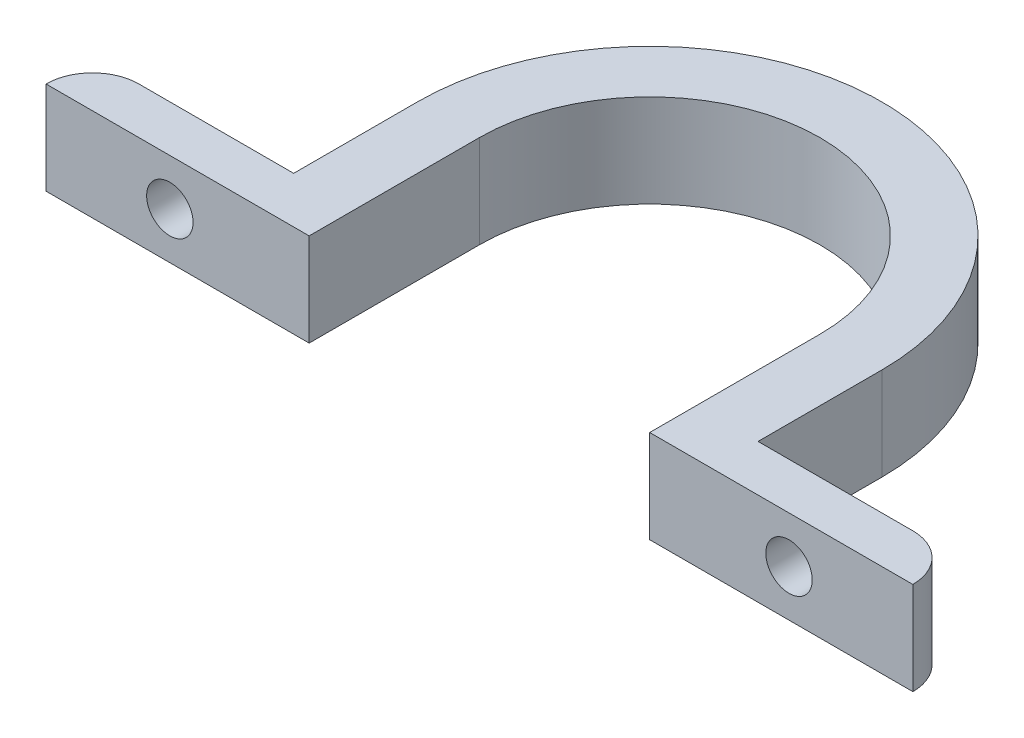
ISO-10303-21;
HEADER;
FILE_DESCRIPTION(('STEP AP214'),'2;1');
FILE_NAME('part.step','',(''),(''),'','','');
FILE_SCHEMA(('AUTOMOTIVE_DESIGN { 1 0 10303 214 1 1 1 1 }'));
ENDSEC;
DATA;
#1=APPLICATION_CONTEXT('core data for automotive mechanical design processes');
#2=APPLICATION_PROTOCOL_DEFINITION('international standard','automotive_design',2000,#1);
#3=PRODUCT_CONTEXT('',#1,'mechanical');
#4=PRODUCT('Part','Part','',(#3));
#5=PRODUCT_RELATED_PRODUCT_CATEGORY('part','',(#4));
#6=PRODUCT_DEFINITION_FORMATION('','',#4);
#7=PRODUCT_DEFINITION_CONTEXT('part definition',#1,'design');
#8=PRODUCT_DEFINITION('design','',#6,#7);
#9=PRODUCT_DEFINITION_SHAPE('','',#8);
#10=(LENGTH_UNIT() NAMED_UNIT(*) SI_UNIT(.MILLI.,.METRE.));
#11=(NAMED_UNIT(*) PLANE_ANGLE_UNIT() SI_UNIT($,.RADIAN.));
#12=(NAMED_UNIT(*) SI_UNIT($,.STERADIAN.) SOLID_ANGLE_UNIT());
#13=UNCERTAINTY_MEASURE_WITH_UNIT(LENGTH_MEASURE(1.E-05),#10,'distance_accuracy_value','');
#14=(GEOMETRIC_REPRESENTATION_CONTEXT(3) GLOBAL_UNCERTAINTY_ASSIGNED_CONTEXT((#13)) GLOBAL_UNIT_ASSIGNED_CONTEXT((#10,
#11,#12)) REPRESENTATION_CONTEXT('',''));
#15=CARTESIAN_POINT('',(0.,0.,0.));
#16=DIRECTION('',(0.,0.,1.));
#17=DIRECTION('',(1.,0.,0.));
#18=AXIS2_PLACEMENT_3D('',#15,#16,#17);
#19=CARTESIAN_POINT('',(13.,6.,-0.5));
#20=DIRECTION('',(0.,-1.,0.));
#21=DIRECTION('',(0.,0.,-1.));
#22=AXIS2_PLACEMENT_3D('',#19,#20,#21);
#23=CYLINDRICAL_SURFACE('',#22,15.);
#24=CARTESIAN_POINT('',(13.,0.,-0.5));
#25=DIRECTION('',(0.,1.,0.));
#26=DIRECTION('',(0.,0.,-1.));
#27=AXIS2_PLACEMENT_3D('',#24,#25,#26);
#28=CIRCLE('',#27,15.);
#29=CARTESIAN_POINT('',(28.,0.,-0.500000000000002));
#30=VERTEX_POINT('',#29);
#31=CARTESIAN_POINT('',(-2.,0.,-0.5));
#32=VERTEX_POINT('',#31);
#33=EDGE_CURVE('E163',#30,#32,#28,.T.);
#34=ORIENTED_EDGE('',*,*,#33,.T.);
#35=DIRECTION('',(0.,-1.,0.));
#36=VECTOR('',#35,1.);
#37=CARTESIAN_POINT('',(-2.,6.,-0.5));
#38=LINE('',#37,#36);
#39=CARTESIAN_POINT('',(-2.,6.,-0.5));
#40=VERTEX_POINT('',#39);
#41=EDGE_CURVE('E11',#40,#32,#38,.T.);
#42=ORIENTED_EDGE('',*,*,#41,.F.);
#43=CARTESIAN_POINT('',(13.,6.,-0.5));
#44=DIRECTION('',(0.,1.,0.));
#45=DIRECTION('',(0.,0.,-1.));
#46=AXIS2_PLACEMENT_3D('',#43,#44,#45);
#47=CIRCLE('',#46,15.);
#48=CARTESIAN_POINT('',(28.,6.,-0.500000000000002));
#49=VERTEX_POINT('',#48);
#50=EDGE_CURVE('E186',#49,#40,#47,.T.);
#51=ORIENTED_EDGE('',*,*,#50,.F.);
#52=DIRECTION('',(0.,-1.,0.));
#53=VECTOR('',#52,1.);
#54=CARTESIAN_POINT('',(28.,6.,-0.500000000000002));
#55=LINE('',#54,#53);
#56=EDGE_CURVE('E159',#49,#30,#55,.T.);
#57=ORIENTED_EDGE('',*,*,#56,.T.);
#58=EDGE_LOOP('',(#34,#42,#51,#57));
#59=FACE_BOUND('',#58,.T.);
#60=ADVANCED_FACE('F43',(#59),#23,.T.);
#61=CARTESIAN_POINT('',(-2.,6.,7.5));
#62=DIRECTION('',(1.,0.,0.));
#63=DIRECTION('',(0.,0.,-1.));
#64=AXIS2_PLACEMENT_3D('',#61,#62,#63);
#65=PLANE('',#64);
#66=DIRECTION('',(0.,0.,1.));
#67=VECTOR('',#66,1.);
#68=CARTESIAN_POINT('',(-2.,0.,7.5));
#69=LINE('',#68,#67);
#70=CARTESIAN_POINT('',(-2.,0.,7.5));
#71=VERTEX_POINT('',#70);
#72=EDGE_CURVE('E166',#32,#71,#69,.T.);
#73=ORIENTED_EDGE('',*,*,#72,.T.);
#74=DIRECTION('',(0.,-1.,0.));
#75=VECTOR('',#74,1.);
#76=CARTESIAN_POINT('',(-2.,6.,7.5));
#77=LINE('',#76,#75);
#78=CARTESIAN_POINT('',(-2.,6.,7.5));
#79=VERTEX_POINT('',#78);
#80=EDGE_CURVE('E51',#79,#71,#77,.T.);
#81=ORIENTED_EDGE('',*,*,#80,.F.);
#82=DIRECTION('',(0.,0.,1.));
#83=VECTOR('',#82,1.);
#84=CARTESIAN_POINT('',(-2.,6.,7.5));
#85=LINE('',#84,#83);
#86=EDGE_CURVE('E114',#40,#79,#85,.T.);
#87=ORIENTED_EDGE('',*,*,#86,.F.);
#88=ORIENTED_EDGE('',*,*,#41,.T.);
#89=EDGE_LOOP('',(#73,#81,#87,#88));
#90=FACE_BOUND('',#89,.T.);
#91=ADVANCED_FACE('F266',(#90),#65,.F.);
#92=CARTESIAN_POINT('',(-12.,6.,7.5));
#93=DIRECTION('',(0.,0.,1.));
#94=DIRECTION('',(1.,0.,0.));
#95=AXIS2_PLACEMENT_3D('',#92,#93,#94);
#96=PLANE('',#95);
#97=CARTESIAN_POINT('',(-7.,3.,7.5));
#98=DIRECTION('',(0.,0.,-1.));
#99=DIRECTION('',(1.,0.,0.));
#100=AXIS2_PLACEMENT_3D('',#97,#98,#99);
#101=CIRCLE('',#100,1.5);
#102=CARTESIAN_POINT('',(-5.5,3.,7.5));
#103=VERTEX_POINT('',#102);
#104=EDGE_CURVE('E390',#103,#103,#101,.T.);
#105=ORIENTED_EDGE('',*,*,#104,.F.);
#106=EDGE_LOOP('',(#105));
#107=FACE_BOUND('',#106,.T.);
#108=DIRECTION('',(-1.,0.,0.));
#109=VECTOR('',#108,1.);
#110=CARTESIAN_POINT('',(-12.,0.,7.5));
#111=LINE('',#110,#109);
#112=CARTESIAN_POINT('',(-12.,0.,7.5));
#113=VERTEX_POINT('',#112);
#114=EDGE_CURVE('E169',#71,#113,#111,.T.);
#115=ORIENTED_EDGE('',*,*,#114,.T.);
#116=DIRECTION('',(0.,-1.,0.));
#117=VECTOR('',#116,1.);
#118=CARTESIAN_POINT('',(-12.,6.,7.5));
#119=LINE('',#118,#117);
#120=CARTESIAN_POINT('',(-12.,6.,7.5));
#121=VERTEX_POINT('',#120);
#122=EDGE_CURVE('E205',#121,#113,#119,.T.);
#123=ORIENTED_EDGE('',*,*,#122,.F.);
#124=DIRECTION('',(-1.,0.,0.));
#125=VECTOR('',#124,1.);
#126=CARTESIAN_POINT('',(-12.,6.,7.5));
#127=LINE('',#126,#125);
#128=EDGE_CURVE('E213',#79,#121,#127,.T.);
#129=ORIENTED_EDGE('',*,*,#128,.F.);
#130=ORIENTED_EDGE('',*,*,#80,.T.);
#131=EDGE_LOOP('',(#115,#123,#129,#130));
#132=FACE_BOUND('',#131,.T.);
#133=ADVANCED_FACE('F211',(#107,#132),#96,.F.);
#134=CARTESIAN_POINT('',(-12.,6.,10.5));
#135=DIRECTION('',(0.,-1.,0.));
#136=DIRECTION('',(0.,0.,-1.));
#137=AXIS2_PLACEMENT_3D('',#134,#135,#136);
#138=CYLINDRICAL_SURFACE('',#137,3.);
#139=CARTESIAN_POINT('',(-12.,0.,10.5));
#140=DIRECTION('',(0.,1.,0.));
#141=DIRECTION('',(0.,0.,-1.));
#142=AXIS2_PLACEMENT_3D('',#139,#140,#141);
#143=CIRCLE('',#142,3.);
#144=CARTESIAN_POINT('',(-15.,0.,10.5));
#145=VERTEX_POINT('',#144);
#146=EDGE_CURVE('E171',#113,#145,#143,.T.);
#147=ORIENTED_EDGE('',*,*,#146,.T.);
#148=DIRECTION('',(0.,-1.,0.));
#149=VECTOR('',#148,1.);
#150=CARTESIAN_POINT('',(-15.,6.,10.5));
#151=LINE('',#150,#149);
#152=CARTESIAN_POINT('',(-15.,6.,10.5));
#153=VERTEX_POINT('',#152);
#154=EDGE_CURVE('E202',#153,#145,#151,.T.);
#155=ORIENTED_EDGE('',*,*,#154,.F.);
#156=CARTESIAN_POINT('',(-12.,6.,10.5));
#157=DIRECTION('',(0.,1.,0.));
#158=DIRECTION('',(0.,0.,-1.));
#159=AXIS2_PLACEMENT_3D('',#156,#157,#158);
#160=CIRCLE('',#159,3.);
#161=EDGE_CURVE('E231',#121,#153,#160,.T.);
#162=ORIENTED_EDGE('',*,*,#161,.F.);
#163=ORIENTED_EDGE('',*,*,#122,.T.);
#164=EDGE_LOOP('',(#147,#155,#162,#163));
#165=FACE_BOUND('',#164,.T.);
#166=ADVANCED_FACE('F222',(#165),#138,.T.);
#167=CARTESIAN_POINT('',(2.,6.,10.5));
#168=DIRECTION('',(0.,0.,-1.));
#169=DIRECTION('',(-1.,0.,0.));
#170=AXIS2_PLACEMENT_3D('',#167,#168,#169);
#171=PLANE('',#170);
#172=CARTESIAN_POINT('',(-7.,3.,10.5));
#173=DIRECTION('',(0.,0.,-1.));
#174=DIRECTION('',(1.,0.,0.));
#175=AXIS2_PLACEMENT_3D('',#172,#173,#174);
#176=CIRCLE('',#175,1.5);
#177=CARTESIAN_POINT('',(-5.5,3.,10.5));
#178=VERTEX_POINT('',#177);
#179=EDGE_CURVE('E387',#178,#178,#176,.T.);
#180=ORIENTED_EDGE('',*,*,#179,.T.);
#181=EDGE_LOOP('',(#180));
#182=FACE_BOUND('',#181,.T.);
#183=DIRECTION('',(1.,0.,0.));
#184=VECTOR('',#183,1.);
#185=CARTESIAN_POINT('',(2.,0.,10.5));
#186=LINE('',#185,#184);
#187=CARTESIAN_POINT('',(2.,0.,10.5));
#188=VERTEX_POINT('',#187);
#189=EDGE_CURVE('E173',#145,#188,#186,.T.);
#190=ORIENTED_EDGE('',*,*,#189,.T.);
#191=DIRECTION('',(0.,-1.,0.));
#192=VECTOR('',#191,1.);
#193=CARTESIAN_POINT('',(2.,6.,10.5));
#194=LINE('',#193,#192);
#195=CARTESIAN_POINT('',(2.,6.,10.5));
#196=VERTEX_POINT('',#195);
#197=EDGE_CURVE('E199',#196,#188,#194,.T.);
#198=ORIENTED_EDGE('',*,*,#197,.F.);
#199=DIRECTION('',(1.,0.,0.));
#200=VECTOR('',#199,1.);
#201=CARTESIAN_POINT('',(2.,6.,10.5));
#202=LINE('',#201,#200);
#203=EDGE_CURVE('E228',#153,#196,#202,.T.);
#204=ORIENTED_EDGE('',*,*,#203,.F.);
#205=ORIENTED_EDGE('',*,*,#154,.T.);
#206=EDGE_LOOP('',(#190,#198,#204,#205));
#207=FACE_BOUND('',#206,.T.);
#208=ADVANCED_FACE('F226',(#182,#207),#171,.F.);
#209=CARTESIAN_POINT('',(2.,6.,-0.500000000000002));
#210=DIRECTION('',(-1.,0.,0.));
#211=DIRECTION('',(0.,0.,1.));
#212=AXIS2_PLACEMENT_3D('',#209,#210,#211);
#213=PLANE('',#212);
#214=DIRECTION('',(0.,0.,-1.));
#215=VECTOR('',#214,1.);
#216=CARTESIAN_POINT('',(2.,0.,-0.500000000000002));
#217=LINE('',#216,#215);
#218=CARTESIAN_POINT('',(2.,0.,-0.500000000000002));
#219=VERTEX_POINT('',#218);
#220=EDGE_CURVE('E175',#188,#219,#217,.T.);
#221=ORIENTED_EDGE('',*,*,#220,.T.);
#222=DIRECTION('',(0.,-1.,0.));
#223=VECTOR('',#222,1.);
#224=CARTESIAN_POINT('',(2.,6.,-0.500000000000002));
#225=LINE('',#224,#223);
#226=CARTESIAN_POINT('',(2.,6.,-0.500000000000002));
#227=VERTEX_POINT('',#226);
#228=EDGE_CURVE('E196',#227,#219,#225,.T.);
#229=ORIENTED_EDGE('',*,*,#228,.F.);
#230=DIRECTION('',(0.,0.,-1.));
#231=VECTOR('',#230,1.);
#232=CARTESIAN_POINT('',(2.,6.,-0.500000000000002));
#233=LINE('',#232,#231);
#234=EDGE_CURVE('E230',#196,#227,#233,.T.);
#235=ORIENTED_EDGE('',*,*,#234,.F.);
#236=ORIENTED_EDGE('',*,*,#197,.T.);
#237=EDGE_LOOP('',(#221,#229,#235,#236));
#238=FACE_BOUND('',#237,.T.);
#239=ADVANCED_FACE('F280',(#238),#213,.F.);
#240=CARTESIAN_POINT('',(13.,6.,-0.5));
#241=DIRECTION('',(0.,-1.,0.));
#242=DIRECTION('',(0.,0.,-1.));
#243=AXIS2_PLACEMENT_3D('',#240,#241,#242);
#244=CYLINDRICAL_SURFACE('',#243,11.);
#245=CARTESIAN_POINT('',(13.,0.,-0.5));
#246=DIRECTION('',(0.,-1.,0.));
#247=DIRECTION('',(0.,0.,-1.));
#248=AXIS2_PLACEMENT_3D('',#245,#246,#247);
#249=CIRCLE('',#248,11.);
#250=CARTESIAN_POINT('',(24.,0.,-0.500000000000001));
#251=VERTEX_POINT('',#250);
#252=EDGE_CURVE('E177',#219,#251,#249,.T.);
#253=ORIENTED_EDGE('',*,*,#252,.T.);
#254=DIRECTION('',(0.,-1.,0.));
#255=VECTOR('',#254,1.);
#256=CARTESIAN_POINT('',(24.,6.,-0.500000000000001));
#257=LINE('',#256,#255);
#258=CARTESIAN_POINT('',(24.,6.,-0.500000000000001));
#259=VERTEX_POINT('',#258);
#260=EDGE_CURVE('E193',#259,#251,#257,.T.);
#261=ORIENTED_EDGE('',*,*,#260,.F.);
#262=CARTESIAN_POINT('',(13.,6.,-0.5));
#263=DIRECTION('',(0.,-1.,0.));
#264=DIRECTION('',(0.,0.,-1.));
#265=AXIS2_PLACEMENT_3D('',#262,#263,#264);
#266=CIRCLE('',#265,11.);
#267=EDGE_CURVE('E233',#227,#259,#266,.T.);
#268=ORIENTED_EDGE('',*,*,#267,.F.);
#269=ORIENTED_EDGE('',*,*,#228,.T.);
#270=EDGE_LOOP('',(#253,#261,#268,#269));
#271=FACE_BOUND('',#270,.T.);
#272=ADVANCED_FACE('F284',(#271),#244,.F.);
#273=CARTESIAN_POINT('',(24.,6.,-0.500000000000002));
#274=DIRECTION('',(1.,0.,0.));
#275=DIRECTION('',(0.,0.,-1.));
#276=AXIS2_PLACEMENT_3D('',#273,#274,#275);
#277=PLANE('',#276);
#278=DIRECTION('',(0.,0.,1.));
#279=VECTOR('',#278,1.);
#280=CARTESIAN_POINT('',(24.,0.,-0.500000000000002));
#281=LINE('',#280,#279);
#282=CARTESIAN_POINT('',(24.,0.,10.5));
#283=VERTEX_POINT('',#282);
#284=EDGE_CURVE('E179',#251,#283,#281,.T.);
#285=ORIENTED_EDGE('',*,*,#284,.T.);
#286=DIRECTION('',(0.,-1.,0.));
#287=VECTOR('',#286,1.);
#288=CARTESIAN_POINT('',(24.,6.,10.5));
#289=LINE('',#288,#287);
#290=CARTESIAN_POINT('',(24.,6.,10.5));
#291=VERTEX_POINT('',#290);
#292=EDGE_CURVE('E190',#291,#283,#289,.T.);
#293=ORIENTED_EDGE('',*,*,#292,.F.);
#294=DIRECTION('',(0.,0.,1.));
#295=VECTOR('',#294,1.);
#296=CARTESIAN_POINT('',(24.,6.,-0.500000000000002));
#297=LINE('',#296,#295);
#298=EDGE_CURVE('E239',#259,#291,#297,.T.);
#299=ORIENTED_EDGE('',*,*,#298,.F.);
#300=ORIENTED_EDGE('',*,*,#260,.T.);
#301=EDGE_LOOP('',(#285,#293,#299,#300));
#302=FACE_BOUND('',#301,.T.);
#303=ADVANCED_FACE('F245',(#302),#277,.F.);
#304=CARTESIAN_POINT('',(24.,6.,10.5));
#305=DIRECTION('',(0.,0.,-1.));
#306=DIRECTION('',(-1.,0.,0.));
#307=AXIS2_PLACEMENT_3D('',#304,#305,#306);
#308=PLANE('',#307);
#309=CARTESIAN_POINT('',(33.,3.,10.5));
#310=DIRECTION('',(0.,0.,-1.));
#311=DIRECTION('',(-1.,0.,0.));
#312=AXIS2_PLACEMENT_3D('',#309,#310,#311);
#313=CIRCLE('',#312,1.5);
#314=CARTESIAN_POINT('',(31.5,3.,10.5));
#315=VERTEX_POINT('',#314);
#316=EDGE_CURVE('E167',#315,#315,#313,.T.);
#317=ORIENTED_EDGE('',*,*,#316,.T.);
#318=EDGE_LOOP('',(#317));
#319=FACE_BOUND('',#318,.T.);
#320=DIRECTION('',(1.,0.,0.));
#321=VECTOR('',#320,1.);
#322=CARTESIAN_POINT('',(24.,0.,10.5));
#323=LINE('',#322,#321);
#324=CARTESIAN_POINT('',(41.,0.,10.5));
#325=VERTEX_POINT('',#324);
#326=EDGE_CURVE('E181',#283,#325,#323,.T.);
#327=ORIENTED_EDGE('',*,*,#326,.T.);
#328=DIRECTION('',(0.,-1.,0.));
#329=VECTOR('',#328,1.);
#330=CARTESIAN_POINT('',(41.,6.,10.5));
#331=LINE('',#330,#329);
#332=CARTESIAN_POINT('',(41.,6.,10.5));
#333=VERTEX_POINT('',#332);
#334=EDGE_CURVE('E154',#333,#325,#331,.T.);
#335=ORIENTED_EDGE('',*,*,#334,.F.);
#336=DIRECTION('',(1.,0.,0.));
#337=VECTOR('',#336,1.);
#338=CARTESIAN_POINT('',(24.,6.,10.5));
#339=LINE('',#338,#337);
#340=EDGE_CURVE('E145',#291,#333,#339,.T.);
#341=ORIENTED_EDGE('',*,*,#340,.F.);
#342=ORIENTED_EDGE('',*,*,#292,.T.);
#343=EDGE_LOOP('',(#327,#335,#341,#342));
#344=FACE_BOUND('',#343,.T.);
#345=ADVANCED_FACE('F249',(#319,#344),#308,.F.);
#346=CARTESIAN_POINT('',(38.,6.,10.5));
#347=DIRECTION('',(0.,-1.,0.));
#348=DIRECTION('',(0.,0.,-1.));
#349=AXIS2_PLACEMENT_3D('',#346,#347,#348);
#350=CYLINDRICAL_SURFACE('',#349,3.);
#351=CARTESIAN_POINT('',(38.,0.,10.5));
#352=DIRECTION('',(0.,1.,0.));
#353=DIRECTION('',(0.,0.,1.));
#354=AXIS2_PLACEMENT_3D('',#351,#352,#353);
#355=CIRCLE('',#354,3.);
#356=CARTESIAN_POINT('',(38.,0.,7.5));
#357=VERTEX_POINT('',#356);
#358=EDGE_CURVE('E153',#325,#357,#355,.T.);
#359=ORIENTED_EDGE('',*,*,#358,.T.);
#360=DIRECTION('',(0.,-1.,0.));
#361=VECTOR('',#360,1.);
#362=CARTESIAN_POINT('',(38.,6.,7.5));
#363=LINE('',#362,#361);
#364=CARTESIAN_POINT('',(38.,6.,7.5));
#365=VERTEX_POINT('',#364);
#366=EDGE_CURVE('E150',#365,#357,#363,.T.);
#367=ORIENTED_EDGE('',*,*,#366,.F.);
#368=CARTESIAN_POINT('',(38.,6.,10.5));
#369=DIRECTION('',(0.,1.,0.));
#370=DIRECTION('',(0.,0.,1.));
#371=AXIS2_PLACEMENT_3D('',#368,#369,#370);
#372=CIRCLE('',#371,3.);
#373=EDGE_CURVE('E139',#333,#365,#372,.T.);
#374=ORIENTED_EDGE('',*,*,#373,.F.);
#375=ORIENTED_EDGE('',*,*,#334,.T.);
#376=EDGE_LOOP('',(#359,#367,#374,#375));
#377=FACE_BOUND('',#376,.T.);
#378=ADVANCED_FACE('F151',(#377),#350,.T.);
#379=CARTESIAN_POINT('',(38.,6.,7.5));
#380=DIRECTION('',(0.,0.,1.));
#381=DIRECTION('',(1.,0.,0.));
#382=AXIS2_PLACEMENT_3D('',#379,#380,#381);
#383=PLANE('',#382);
#384=CARTESIAN_POINT('',(33.,3.,7.50000000000001));
#385=DIRECTION('',(0.,0.,-1.));
#386=DIRECTION('',(-1.,0.,0.));
#387=AXIS2_PLACEMENT_3D('',#384,#385,#386);
#388=CIRCLE('',#387,1.5);
#389=CARTESIAN_POINT('',(31.5,3.,7.50000000000001));
#390=VERTEX_POINT('',#389);
#391=EDGE_CURVE('E391',#390,#390,#388,.T.);
#392=ORIENTED_EDGE('',*,*,#391,.F.);
#393=EDGE_LOOP('',(#392));
#394=FACE_BOUND('',#393,.T.);
#395=DIRECTION('',(-1.,0.,0.));
#396=VECTOR('',#395,1.);
#397=CARTESIAN_POINT('',(38.,0.,7.5));
#398=LINE('',#397,#396);
#399=CARTESIAN_POINT('',(28.,0.,7.5));
#400=VERTEX_POINT('',#399);
#401=EDGE_CURVE('E100',#357,#400,#398,.T.);
#402=ORIENTED_EDGE('',*,*,#401,.T.);
#403=DIRECTION('',(0.,-1.,0.));
#404=VECTOR('',#403,1.);
#405=CARTESIAN_POINT('',(28.,6.,7.5));
#406=LINE('',#405,#404);
#407=CARTESIAN_POINT('',(28.,6.,7.5));
#408=VERTEX_POINT('',#407);
#409=EDGE_CURVE('E155',#408,#400,#406,.T.);
#410=ORIENTED_EDGE('',*,*,#409,.F.);
#411=DIRECTION('',(-1.,0.,0.));
#412=VECTOR('',#411,1.);
#413=CARTESIAN_POINT('',(38.,6.,7.5));
#414=LINE('',#413,#412);
#415=EDGE_CURVE('E143',#365,#408,#414,.T.);
#416=ORIENTED_EDGE('',*,*,#415,.F.);
#417=ORIENTED_EDGE('',*,*,#366,.T.);
#418=EDGE_LOOP('',(#402,#410,#416,#417));
#419=FACE_BOUND('',#418,.T.);
#420=ADVANCED_FACE('F157',(#394,#419),#383,.F.);
#421=CARTESIAN_POINT('',(28.,6.,7.5));
#422=DIRECTION('',(-1.,0.,0.));
#423=DIRECTION('',(0.,0.,1.));
#424=AXIS2_PLACEMENT_3D('',#421,#422,#423);
#425=PLANE('',#424);
#426=DIRECTION('',(0.,0.,-1.));
#427=VECTOR('',#426,1.);
#428=CARTESIAN_POINT('',(28.,0.,7.5));
#429=LINE('',#428,#427);
#430=EDGE_CURVE('E106',#400,#30,#429,.T.);
#431=ORIENTED_EDGE('',*,*,#430,.T.);
#432=ORIENTED_EDGE('',*,*,#56,.F.);
#433=DIRECTION('',(0.,0.,-1.));
#434=VECTOR('',#433,1.);
#435=CARTESIAN_POINT('',(28.,6.,7.5));
#436=LINE('',#435,#434);
#437=EDGE_CURVE('E59',#408,#49,#436,.T.);
#438=ORIENTED_EDGE('',*,*,#437,.F.);
#439=ORIENTED_EDGE('',*,*,#409,.T.);
#440=EDGE_LOOP('',(#431,#432,#438,#439));
#441=FACE_BOUND('',#440,.T.);
#442=ADVANCED_FACE('F253',(#441),#425,.F.);
#443=CARTESIAN_POINT('',(13.,6.,-0.5));
#444=DIRECTION('',(0.,-1.,0.));
#445=DIRECTION('',(0.,0.,-1.));
#446=AXIS2_PLACEMENT_3D('',#443,#444,#445);
#447=PLANE('',#446);
#448=ORIENTED_EDGE('',*,*,#50,.T.);
#449=ORIENTED_EDGE('',*,*,#86,.T.);
#450=ORIENTED_EDGE('',*,*,#128,.T.);
#451=ORIENTED_EDGE('',*,*,#161,.T.);
#452=ORIENTED_EDGE('',*,*,#203,.T.);
#453=ORIENTED_EDGE('',*,*,#234,.T.);
#454=ORIENTED_EDGE('',*,*,#267,.T.);
#455=ORIENTED_EDGE('',*,*,#298,.T.);
#456=ORIENTED_EDGE('',*,*,#340,.T.);
#457=ORIENTED_EDGE('',*,*,#373,.T.);
#458=ORIENTED_EDGE('',*,*,#415,.T.);
#459=ORIENTED_EDGE('',*,*,#437,.T.);
#460=EDGE_LOOP('',(#448,#449,#450,#451,#452,#453,#454,#455,#456,#457,#458,#459));
#461=FACE_BOUND('',#460,.T.);
#462=ADVANCED_FACE('F141',(#461),#447,.F.);
#463=CARTESIAN_POINT('',(13.,0.,-0.5));
#464=DIRECTION('',(0.,-1.,0.));
#465=DIRECTION('',(0.,0.,-1.));
#466=AXIS2_PLACEMENT_3D('',#463,#464,#465);
#467=PLANE('',#466);
#468=ORIENTED_EDGE('',*,*,#33,.F.);
#469=ORIENTED_EDGE('',*,*,#430,.F.);
#470=ORIENTED_EDGE('',*,*,#401,.F.);
#471=ORIENTED_EDGE('',*,*,#358,.F.);
#472=ORIENTED_EDGE('',*,*,#326,.F.);
#473=ORIENTED_EDGE('',*,*,#284,.F.);
#474=ORIENTED_EDGE('',*,*,#252,.F.);
#475=ORIENTED_EDGE('',*,*,#220,.F.);
#476=ORIENTED_EDGE('',*,*,#189,.F.);
#477=ORIENTED_EDGE('',*,*,#146,.F.);
#478=ORIENTED_EDGE('',*,*,#114,.F.);
#479=ORIENTED_EDGE('',*,*,#72,.F.);
#480=EDGE_LOOP('',(#468,#469,#470,#471,#472,#473,#474,#475,#476,#477,#478,#479));
#481=FACE_BOUND('',#480,.T.);
#482=ADVANCED_FACE('F217',(#481),#467,.T.);
#483=CARTESIAN_POINT('',(33.,3.,10.5));
#484=DIRECTION('',(0.,0.,-1.));
#485=DIRECTION('',(-1.,0.,0.));
#486=AXIS2_PLACEMENT_3D('',#483,#484,#485);
#487=CYLINDRICAL_SURFACE('',#486,1.5);
#488=ORIENTED_EDGE('',*,*,#316,.F.);
#489=EDGE_LOOP('',(#488));
#490=FACE_BOUND('',#489,.T.);
#491=ORIENTED_EDGE('',*,*,#391,.T.);
#492=EDGE_LOOP('',(#491));
#493=FACE_BOUND('',#492,.T.);
#494=ADVANCED_FACE('F343',(#490,#493),#487,.F.);
#495=CARTESIAN_POINT('',(-7.,3.,10.5));
#496=DIRECTION('',(0.,0.,-1.));
#497=DIRECTION('',(-1.,0.,0.));
#498=AXIS2_PLACEMENT_3D('',#495,#496,#497);
#499=CYLINDRICAL_SURFACE('',#498,1.5);
#500=ORIENTED_EDGE('',*,*,#179,.F.);
#501=EDGE_LOOP('',(#500));
#502=FACE_BOUND('',#501,.T.);
#503=ORIENTED_EDGE('',*,*,#104,.T.);
#504=EDGE_LOOP('',(#503));
#505=FACE_BOUND('',#504,.T.);
#506=ADVANCED_FACE('F347',(#502,#505),#499,.F.);
#507=CLOSED_SHELL('',(#60,#91,#133,#166,#208,#239,#272,#303,#345,#378,#420,#442,#462,#482,#494,#506));
#508=MANIFOLD_SOLID_BREP('B2',#507);
#509=ADVANCED_BREP_SHAPE_REPRESENTATION('',(#18,#508),#14);
#510=SHAPE_DEFINITION_REPRESENTATION(#9,#509);
ENDSEC;
END-ISO-10303-21;
